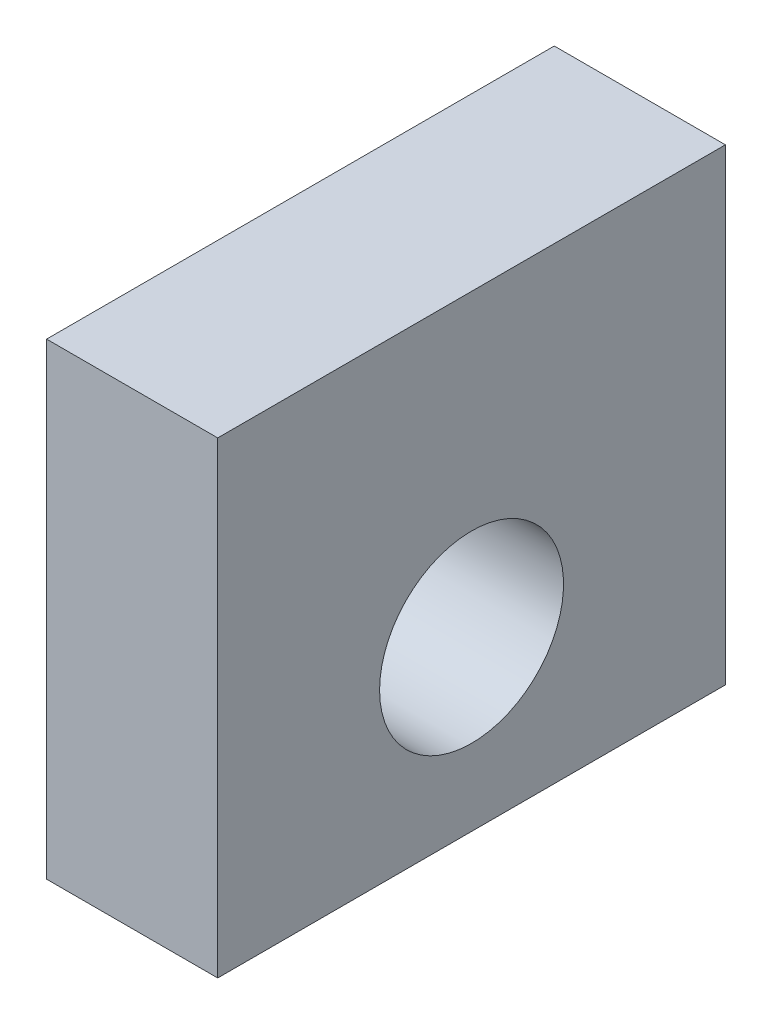
ISO-10303-21;
HEADER;
FILE_DESCRIPTION(('STEP AP214'),'2;1');
FILE_NAME('part.step','',(''),(''),'','','');
FILE_SCHEMA(('AUTOMOTIVE_DESIGN { 1 0 10303 214 1 1 1 1 }'));
ENDSEC;
DATA;
#1=APPLICATION_CONTEXT('core data for automotive mechanical design processes');
#2=APPLICATION_PROTOCOL_DEFINITION('international standard','automotive_design',2000,#1);
#3=PRODUCT_CONTEXT('',#1,'mechanical');
#4=PRODUCT('Part','Part','',(#3));
#5=PRODUCT_RELATED_PRODUCT_CATEGORY('part','',(#4));
#6=PRODUCT_DEFINITION_FORMATION('','',#4);
#7=PRODUCT_DEFINITION_CONTEXT('part definition',#1,'design');
#8=PRODUCT_DEFINITION('design','',#6,#7);
#9=PRODUCT_DEFINITION_SHAPE('','',#8);
#10=(LENGTH_UNIT() NAMED_UNIT(*) SI_UNIT(.MILLI.,.METRE.));
#11=(NAMED_UNIT(*) PLANE_ANGLE_UNIT() SI_UNIT($,.RADIAN.));
#12=(NAMED_UNIT(*) SI_UNIT($,.STERADIAN.) SOLID_ANGLE_UNIT());
#13=UNCERTAINTY_MEASURE_WITH_UNIT(LENGTH_MEASURE(1.E-05),#10,'distance_accuracy_value','');
#14=(GEOMETRIC_REPRESENTATION_CONTEXT(3) GLOBAL_UNCERTAINTY_ASSIGNED_CONTEXT((#13)) GLOBAL_UNIT_ASSIGNED_CONTEXT((#10,
#11,#12)) REPRESENTATION_CONTEXT('',''));
#15=CARTESIAN_POINT('',(0.,0.,0.));
#16=DIRECTION('',(0.,0.,1.));
#17=DIRECTION('',(1.,0.,0.));
#18=AXIS2_PLACEMENT_3D('',#15,#16,#17);
#19=CARTESIAN_POINT('',(3.,98.5,-8.9));
#20=DIRECTION('',(0.,0.,1.));
#21=DIRECTION('',(1.,0.,0.));
#22=AXIS2_PLACEMENT_3D('',#19,#20,#21);
#23=PLANE('',#22);
#24=DIRECTION('',(0.,1.,0.));
#25=VECTOR('',#24,1.);
#26=CARTESIAN_POINT('',(-3.,98.5,-8.9));
#27=LINE('',#26,#25);
#28=CARTESIAN_POINT('',(-3.,82.1,-8.9));
#29=VERTEX_POINT('',#28);
#30=CARTESIAN_POINT('',(-3.,98.5,-8.9));
#31=VERTEX_POINT('',#30);
#32=EDGE_CURVE('E106',#29,#31,#27,.T.);
#33=ORIENTED_EDGE('',*,*,#32,.T.);
#34=DIRECTION('',(-1.,0.,0.));
#35=VECTOR('',#34,1.);
#36=CARTESIAN_POINT('',(3.,98.5,-8.9));
#37=LINE('',#36,#35);
#38=CARTESIAN_POINT('',(3.,98.5,-8.9));
#39=VERTEX_POINT('',#38);
#40=EDGE_CURVE('E11',#39,#31,#37,.T.);
#41=ORIENTED_EDGE('',*,*,#40,.F.);
#42=DIRECTION('',(0.,1.,0.));
#43=VECTOR('',#42,1.);
#44=CARTESIAN_POINT('',(3.,98.5,-8.9));
#45=LINE('',#44,#43);
#46=CARTESIAN_POINT('',(3.,82.1,-8.9));
#47=VERTEX_POINT('',#46);
#48=EDGE_CURVE('E91',#47,#39,#45,.T.);
#49=ORIENTED_EDGE('',*,*,#48,.F.);
#50=DIRECTION('',(-1.,0.,0.));
#51=VECTOR('',#50,1.);
#52=CARTESIAN_POINT('',(3.,82.1,-8.9));
#53=LINE('',#52,#51);
#54=EDGE_CURVE('E105',#47,#29,#53,.T.);
#55=ORIENTED_EDGE('',*,*,#54,.T.);
#56=EDGE_LOOP('',(#33,#41,#49,#55));
#57=FACE_BOUND('',#56,.T.);
#58=ADVANCED_FACE('F41',(#57),#23,.F.);
#59=CARTESIAN_POINT('',(3.,98.5,8.9));
#60=DIRECTION('',(0.,-1.,0.));
#61=DIRECTION('',(0.,0.,-1.));
#62=AXIS2_PLACEMENT_3D('',#59,#60,#61);
#63=PLANE('',#62);
#64=DIRECTION('',(0.,0.,1.));
#65=VECTOR('',#64,1.);
#66=CARTESIAN_POINT('',(-3.,98.5,8.9));
#67=LINE('',#66,#65);
#68=CARTESIAN_POINT('',(-3.,98.5,8.9));
#69=VERTEX_POINT('',#68);
#70=EDGE_CURVE('E100',#31,#69,#67,.T.);
#71=ORIENTED_EDGE('',*,*,#70,.T.);
#72=DIRECTION('',(-1.,0.,0.));
#73=VECTOR('',#72,1.);
#74=CARTESIAN_POINT('',(3.,98.5,8.9));
#75=LINE('',#74,#73);
#76=CARTESIAN_POINT('',(3.,98.5,8.9));
#77=VERTEX_POINT('',#76);
#78=EDGE_CURVE('E49',#77,#69,#75,.T.);
#79=ORIENTED_EDGE('',*,*,#78,.F.);
#80=DIRECTION('',(0.,0.,1.));
#81=VECTOR('',#80,1.);
#82=CARTESIAN_POINT('',(3.,98.5,8.9));
#83=LINE('',#82,#81);
#84=EDGE_CURVE('E86',#39,#77,#83,.T.);
#85=ORIENTED_EDGE('',*,*,#84,.F.);
#86=ORIENTED_EDGE('',*,*,#40,.T.);
#87=EDGE_LOOP('',(#71,#79,#85,#86));
#88=FACE_BOUND('',#87,.T.);
#89=ADVANCED_FACE('F96',(#88),#63,.F.);
#90=CARTESIAN_POINT('',(3.,82.1,8.9));
#91=DIRECTION('',(0.,0.,-1.));
#92=DIRECTION('',(-1.,0.,0.));
#93=AXIS2_PLACEMENT_3D('',#90,#91,#92);
#94=PLANE('',#93);
#95=DIRECTION('',(0.,-1.,0.));
#96=VECTOR('',#95,1.);
#97=CARTESIAN_POINT('',(-3.,82.1,8.9));
#98=LINE('',#97,#96);
#99=CARTESIAN_POINT('',(-3.,82.1,8.9));
#100=VERTEX_POINT('',#99);
#101=EDGE_CURVE('E73',#69,#100,#98,.T.);
#102=ORIENTED_EDGE('',*,*,#101,.T.);
#103=DIRECTION('',(-1.,0.,0.));
#104=VECTOR('',#103,1.);
#105=CARTESIAN_POINT('',(3.,82.1,8.9));
#106=LINE('',#105,#104);
#107=CARTESIAN_POINT('',(3.,82.1,8.9));
#108=VERTEX_POINT('',#107);
#109=EDGE_CURVE('E98',#108,#100,#106,.T.);
#110=ORIENTED_EDGE('',*,*,#109,.F.);
#111=DIRECTION('',(0.,-1.,0.));
#112=VECTOR('',#111,1.);
#113=CARTESIAN_POINT('',(3.,82.1,8.9));
#114=LINE('',#113,#112);
#115=EDGE_CURVE('E93',#77,#108,#114,.T.);
#116=ORIENTED_EDGE('',*,*,#115,.F.);
#117=ORIENTED_EDGE('',*,*,#78,.T.);
#118=EDGE_LOOP('',(#102,#110,#116,#117));
#119=FACE_BOUND('',#118,.T.);
#120=ADVANCED_FACE('F99',(#119),#94,.F.);
#121=CARTESIAN_POINT('',(3.,82.1,-8.9));
#122=DIRECTION('',(0.,1.,0.));
#123=DIRECTION('',(0.,0.,1.));
#124=AXIS2_PLACEMENT_3D('',#121,#122,#123);
#125=PLANE('',#124);
#126=DIRECTION('',(0.,0.,-1.));
#127=VECTOR('',#126,1.);
#128=CARTESIAN_POINT('',(-3.,82.1,-8.9));
#129=LINE('',#128,#127);
#130=EDGE_CURVE('E84',#100,#29,#129,.T.);
#131=ORIENTED_EDGE('',*,*,#130,.T.);
#132=ORIENTED_EDGE('',*,*,#54,.F.);
#133=DIRECTION('',(0.,0.,-1.));
#134=VECTOR('',#133,1.);
#135=CARTESIAN_POINT('',(3.,82.1,-8.9));
#136=LINE('',#135,#134);
#137=EDGE_CURVE('E59',#108,#47,#136,.T.);
#138=ORIENTED_EDGE('',*,*,#137,.F.);
#139=ORIENTED_EDGE('',*,*,#109,.T.);
#140=EDGE_LOOP('',(#131,#132,#138,#139));
#141=FACE_BOUND('',#140,.T.);
#142=ADVANCED_FACE('F111',(#141),#125,.F.);
#143=CARTESIAN_POINT('',(3.,0.,0.));
#144=DIRECTION('',(-1.,0.,0.));
#145=DIRECTION('',(0.,0.,1.));
#146=AXIS2_PLACEMENT_3D('',#143,#144,#145);
#147=PLANE('',#146);
#148=CARTESIAN_POINT('',(3.,88.,0.));
#149=DIRECTION('',(-1.,0.,0.));
#150=DIRECTION('',(0.,0.,1.));
#151=AXIS2_PLACEMENT_3D('',#148,#149,#150);
#152=CIRCLE('',#151,3.225);
#153=CARTESIAN_POINT('',(3.,88.,3.225));
#154=VERTEX_POINT('',#153);
#155=EDGE_CURVE('E108',#154,#154,#152,.T.);
#156=ORIENTED_EDGE('',*,*,#155,.T.);
#157=EDGE_LOOP('',(#156));
#158=FACE_BOUND('',#157,.T.);
#159=ORIENTED_EDGE('',*,*,#48,.T.);
#160=ORIENTED_EDGE('',*,*,#84,.T.);
#161=ORIENTED_EDGE('',*,*,#115,.T.);
#162=ORIENTED_EDGE('',*,*,#137,.T.);
#163=EDGE_LOOP('',(#159,#160,#161,#162));
#164=FACE_BOUND('',#163,.T.);
#165=ADVANCED_FACE('F90',(#158,#164),#147,.F.);
#166=CARTESIAN_POINT('',(-3.,0.,0.));
#167=DIRECTION('',(-1.,0.,0.));
#168=DIRECTION('',(0.,0.,1.));
#169=AXIS2_PLACEMENT_3D('',#166,#167,#168);
#170=PLANE('',#169);
#171=CARTESIAN_POINT('',(-3.,88.,0.));
#172=DIRECTION('',(-1.,0.,0.));
#173=DIRECTION('',(0.,0.,1.));
#174=AXIS2_PLACEMENT_3D('',#171,#172,#173);
#175=CIRCLE('',#174,3.225);
#176=CARTESIAN_POINT('',(-3.,88.,3.225));
#177=VERTEX_POINT('',#176);
#178=EDGE_CURVE('E42',#177,#177,#175,.T.);
#179=ORIENTED_EDGE('',*,*,#178,.F.);
#180=EDGE_LOOP('',(#179));
#181=FACE_BOUND('',#180,.T.);
#182=ORIENTED_EDGE('',*,*,#32,.F.);
#183=ORIENTED_EDGE('',*,*,#130,.F.);
#184=ORIENTED_EDGE('',*,*,#101,.F.);
#185=ORIENTED_EDGE('',*,*,#70,.F.);
#186=EDGE_LOOP('',(#182,#183,#184,#185));
#187=FACE_BOUND('',#186,.T.);
#188=ADVANCED_FACE('F116',(#181,#187),#170,.T.);
#189=CARTESIAN_POINT('',(-4.,88.,0.));
#190=DIRECTION('',(1.,0.,0.));
#191=DIRECTION('',(0.,0.,-1.));
#192=AXIS2_PLACEMENT_3D('',#189,#190,#191);
#193=CYLINDRICAL_SURFACE('',#192,3.225);
#194=ORIENTED_EDGE('',*,*,#178,.T.);
#195=EDGE_LOOP('',(#194));
#196=FACE_BOUND('',#195,.T.);
#197=ORIENTED_EDGE('',*,*,#155,.F.);
#198=EDGE_LOOP('',(#197));
#199=FACE_BOUND('',#198,.T.);
#200=ADVANCED_FACE('F127',(#196,#199),#193,.F.);
#201=CLOSED_SHELL('',(#58,#89,#120,#142,#165,#188,#200));
#202=MANIFOLD_SOLID_BREP('B2',#201);
#203=ADVANCED_BREP_SHAPE_REPRESENTATION('',(#18,#202),#14);
#204=SHAPE_DEFINITION_REPRESENTATION(#9,#203);
ENDSEC;
END-ISO-10303-21;
